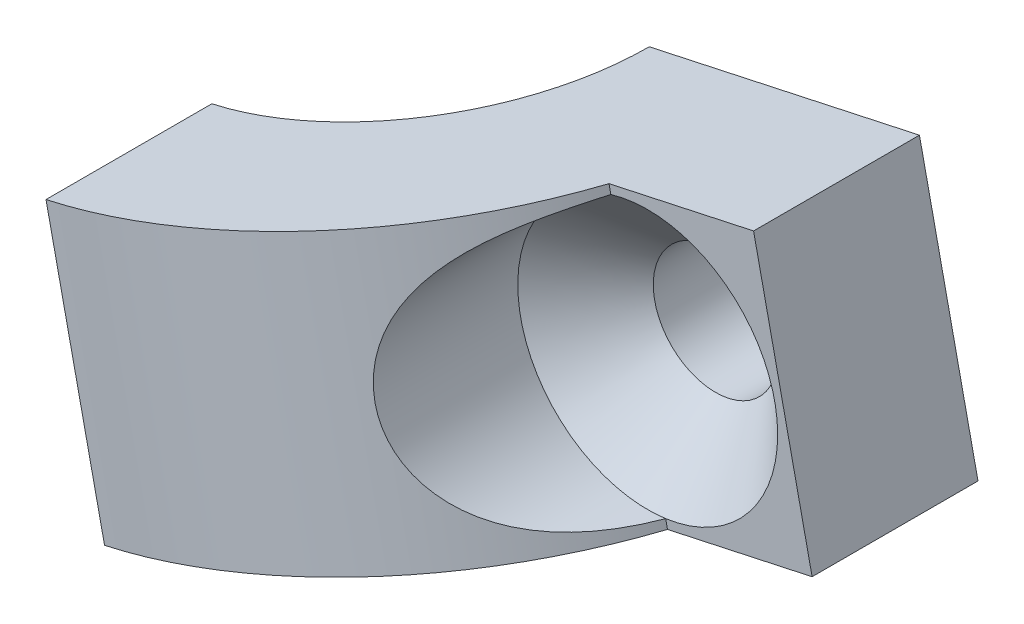
ISO-10303-21;
HEADER;
FILE_DESCRIPTION(('STEP AP214'),'2;1');
FILE_NAME('part.step','',(''),(''),'','','');
FILE_SCHEMA(('AUTOMOTIVE_DESIGN { 1 0 10303 214 1 1 1 1 }'));
ENDSEC;
DATA;
#1=APPLICATION_CONTEXT('core data for automotive mechanical design processes');
#2=APPLICATION_PROTOCOL_DEFINITION('international standard','automotive_design',2000,#1);
#3=PRODUCT_CONTEXT('',#1,'mechanical');
#4=PRODUCT('Part','Part','',(#3));
#5=PRODUCT_RELATED_PRODUCT_CATEGORY('part','',(#4));
#6=PRODUCT_DEFINITION_FORMATION('','',#4);
#7=PRODUCT_DEFINITION_CONTEXT('part definition',#1,'design');
#8=PRODUCT_DEFINITION('design','',#6,#7);
#9=PRODUCT_DEFINITION_SHAPE('','',#8);
#10=(LENGTH_UNIT() NAMED_UNIT(*) SI_UNIT(.MILLI.,.METRE.));
#11=(NAMED_UNIT(*) PLANE_ANGLE_UNIT() SI_UNIT($,.RADIAN.));
#12=(NAMED_UNIT(*) SI_UNIT($,.STERADIAN.) SOLID_ANGLE_UNIT());
#13=UNCERTAINTY_MEASURE_WITH_UNIT(LENGTH_MEASURE(1.E-05),#10,'distance_accuracy_value','');
#14=(GEOMETRIC_REPRESENTATION_CONTEXT(3) GLOBAL_UNCERTAINTY_ASSIGNED_CONTEXT((#13)) GLOBAL_UNIT_ASSIGNED_CONTEXT((#10,
#11,#12)) REPRESENTATION_CONTEXT('',''));
#15=CARTESIAN_POINT('',(0.,0.,0.));
#16=DIRECTION('',(0.,0.,1.));
#17=DIRECTION('',(1.,0.,0.));
#18=AXIS2_PLACEMENT_3D('',#15,#16,#17);
#19=CARTESIAN_POINT('',(-88.763948051682,-50.8660520084268,10.0615310259319));
#20=DIRECTION('',(0.21174441426743,-0.977325075410707,0.));
#21=DIRECTION('',(0.977325075410707,0.21174441426743,0.));
#22=AXIS2_PLACEMENT_3D('',#19,#20,#21);
#23=CYLINDRICAL_SURFACE('',#22,14.);
#24=CARTESIAN_POINT('',(-74.3505115745629,-57.6549076022219,16.0615310259319));
#25=CARTESIAN_POINT('',(-74.4105318311961,-57.6632767572205,16.1889325853136));
#26=CARTESIAN_POINT('',(-74.4726900893355,-57.6707717632351,16.3153746019921));
#27=CARTESIAN_POINT('',(-74.6013086436039,-57.6835064911919,16.566208653269));
#28=CARTESIAN_POINT('',(-74.6677701136839,-57.6887455946981,16.6906001167495));
#29=CARTESIAN_POINT('',(-74.8741545338677,-57.700343096729,17.0613993256941));
#30=CARTESIAN_POINT('',(-75.020590186598,-57.7025053316506,17.3043941340061));
#31=CARTESIAN_POINT('',(-75.3322600846562,-57.6908700686888,17.7823935250871));
#32=CARTESIAN_POINT('',(-75.4977221488477,-57.6768559368391,18.0172452416825));
#33=CARTESIAN_POINT('',(-75.8440735541703,-57.6268844159477,18.4723852549877));
#34=CARTESIAN_POINT('',(-76.0249302380549,-57.5909725283343,18.6927027032967));
#35=CARTESIAN_POINT('',(-76.3097669959853,-57.5149460669118,19.0146603048789));
#36=CARTESIAN_POINT('',(-76.4092439699416,-57.4850164570772,19.1227588173579));
#37=CARTESIAN_POINT('',(-76.6109515356726,-57.4165799788593,19.3335923509711));
#38=CARTESIAN_POINT('',(-76.7131822088843,-57.3780728565623,19.436327213218));
#39=CARTESIAN_POINT('',(-76.9191261447044,-57.2917792890537,19.6354085489783));
#40=CARTESIAN_POINT('',(-77.0228322603495,-57.2440288175781,19.7317779063903));
#41=CARTESIAN_POINT('',(-77.2310338652996,-57.1383707783662,19.917903786673));
#42=CARTESIAN_POINT('',(-77.3355293427551,-57.0804633628119,20.0076604085941));
#43=CARTESIAN_POINT('',(-77.5453740867343,-56.9530155936544,20.1810152179169));
#44=CARTESIAN_POINT('',(-77.6507166920066,-56.8833332522485,20.2645177185925));
#45=CARTESIAN_POINT('',(-77.8592827174098,-56.7324337160199,20.4233431233227));
#46=CARTESIAN_POINT('',(-77.9625065555144,-56.6512188217727,20.4986676534873));
#47=CARTESIAN_POINT('',(-78.1651007332548,-56.4770649067463,20.64051728855));
#48=CARTESIAN_POINT('',(-78.2644706227155,-56.3841245216872,20.7070413676531));
#49=CARTESIAN_POINT('',(-78.4574392958355,-56.1867146221291,20.8306962928452));
#50=CARTESIAN_POINT('',(-78.551039373874,-56.0822477082304,20.8878292505336));
#51=CARTESIAN_POINT('',(-78.7174399489771,-55.8784263140686,20.9846090018167));
#52=CARTESIAN_POINT('',(-78.7912819048968,-55.7805526266571,21.0255909416124));
#53=CARTESIAN_POINT('',(-78.9322090794733,-55.5774028618955,21.1001369687582));
#54=CARTESIAN_POINT('',(-78.9992954927088,-55.4721280988839,21.1337023688287));
#55=CARTESIAN_POINT('',(-79.1256123651839,-55.2550139874895,21.1932274542522));
#56=CARTESIAN_POINT('',(-79.184847746796,-55.1431788163619,21.2191919176383));
#57=CARTESIAN_POINT('',(-79.2945734116947,-54.9138418661736,21.2634208043114));
#58=CARTESIAN_POINT('',(-79.3450647738362,-54.7963407884743,21.2816861779271));
#59=CARTESIAN_POINT('',(-79.4301837055664,-54.5734260462372,21.3084455172993));
#60=CARTESIAN_POINT('',(-79.4660404995759,-54.4685991189413,21.3179440380137));
#61=CARTESIAN_POINT('',(-79.5303313630754,-54.2563400197448,21.3311509714235));
#62=CARTESIAN_POINT('',(-79.5587660666431,-54.1489080712517,21.334859878867));
#63=CARTESIAN_POINT('',(-79.6079440541267,-53.9322996460521,21.3364774977943));
#64=CARTESIAN_POINT('',(-79.6286902644741,-53.8231238496363,21.3343884187113));
#65=CARTESIAN_POINT('',(-79.662369388805,-53.6038346358174,21.3244206225268));
#66=CARTESIAN_POINT('',(-79.6753023008791,-53.4937212181851,21.3165419040106));
#67=CARTESIAN_POINT('',(-79.6929791042372,-53.2778506153099,21.2954505703755));
#68=CARTESIAN_POINT('',(-79.6980312203503,-53.1720962108652,21.2824650487072));
#69=CARTESIAN_POINT('',(-79.7010231309726,-52.9612353378817,21.2512127947903));
#70=CARTESIAN_POINT('',(-79.6989606026073,-52.8561290921841,21.2329443394901));
#71=CARTESIAN_POINT('',(-79.6879181095969,-52.6473751432259,21.1911919404382));
#72=CARTESIAN_POINT('',(-79.678941083093,-52.5437268394934,21.1677102149498));
#73=CARTESIAN_POINT('',(-79.6543634882828,-52.338495999793,21.1155958879873));
#74=CARTESIAN_POINT('',(-79.6387604414274,-52.2369142517624,21.086961361353));
#75=CARTESIAN_POINT('',(-79.6008593331339,-52.0340883090887,21.0239003100824));
#76=CARTESIAN_POINT('',(-79.5784100892131,-51.9329102800488,20.9893516503842));
#77=CARTESIAN_POINT('',(-79.5274539721781,-51.7340145586411,20.9151043767202));
#78=CARTESIAN_POINT('',(-79.4989449150615,-51.6362981287127,20.8754039080182));
#79=CARTESIAN_POINT('',(-79.4051412834227,-51.3491898177122,20.7488192815317));
#80=CARTESIAN_POINT('',(-79.331544955748,-51.1657091317666,20.6544116195021));
#81=CARTESIAN_POINT('',(-79.1598257095648,-50.8023015106871,20.4380344812624));
#82=CARTESIAN_POINT('',(-79.0600922675955,-50.6241782103171,20.3143498368074));
#83=CARTESIAN_POINT('',(-78.84677934502,-50.2923799142761,20.0478744005485));
#84=CARTESIAN_POINT('',(-78.7332001980957,-50.1387043296202,19.9050840691839));
#85=CARTESIAN_POINT('',(-78.5259357099715,-49.8891254587009,19.6388931042252));
#86=CARTESIAN_POINT('',(-78.4338912533118,-49.7881513772491,19.5188834735346));
#87=CARTESIAN_POINT('',(-78.2473437508216,-49.5996554295464,19.2704106774982));
#88=CARTESIAN_POINT('',(-78.1528395902768,-49.5121397911685,19.1419436375335));
#89=CARTESIAN_POINT('',(-77.9628513814775,-49.349350254235,18.8770505201755));
#90=CARTESIAN_POINT('',(-77.8673648074618,-49.274137074378,18.7405892291127));
#91=CARTESIAN_POINT('',(-77.6773833963092,-49.1353578461636,18.4611918883765));
#92=CARTESIAN_POINT('',(-77.5828888098764,-49.0717946783308,18.3182542482596));
#93=CARTESIAN_POINT('',(-77.3837390426929,-48.9474269452014,18.0073805012688));
#94=CARTESIAN_POINT('',(-77.2794026870516,-48.8881118950006,17.8386468655717));
#95=CARTESIAN_POINT('',(-77.0749911289246,-48.7812666096272,17.4949256562108));
#96=CARTESIAN_POINT('',(-76.9749176655176,-48.7337411466809,17.3199355827311));
#97=CARTESIAN_POINT('',(-76.7813685715217,-48.6493966071976,16.9668262209334));
#98=CARTESIAN_POINT('',(-76.6878262056926,-48.6124513617191,16.7887732048334));
#99=CARTESIAN_POINT('',(-76.506852766219,-48.5470720423813,16.4283049218811));
#100=CARTESIAN_POINT('',(-76.4194149684694,-48.5186284869277,16.2458947615158));
#101=CARTESIAN_POINT('',(-76.3353543645785,-48.4936901215073,16.0615310259319));
#102=B_SPLINE_CURVE_WITH_KNOTS('',3,(#24,#25,#26,#27,#28,#29,#30,#31,#32,#33,#34,#35,#36,#37,
#38,#39,#40,#41,#42,#43,#44,#45,#46,#47,#48,#49,#50,#51,#52,#53,#54,#55,#56,#57,#58,#59,#60,#61,
#62,#63,#64,#65,#66,#67,#68,#69,#70,#71,#72,#73,#74,#75,#76,#77,#78,#79,#80,#81,#82,#83,#84,#85,
#86,#87,#88,#89,#90,#91,#92,#93,#94,#95,#96,#97,#98,#99,#100,#101),.UNSPECIFIED.,.F.,.F.,(4,2,2,
2,2,2,2,2,2,2,2,2,2,2,2,2,2,2,2,2,2,2,2,2,2,2,2,2,2,2,2,2,2,2,2,2,2,2,4),(0.,0.423195212599901,
0.846506366717778,1.69656664790167,2.55814432224946,3.41793779315518,3.86740222850699,
4.31687997078536,4.76464236023339,5.21239804140925,5.66599869222498,6.11950898313149,
6.57307208944403,7.02653307189473,7.41378176107854,7.80096185260986,8.18789803323318,
8.57478643881463,8.90796041086747,9.24110591016724,9.57412447546437,9.90714312214091,
10.2267778523461,10.5465169506049,10.8661202587181,11.1858432240619,11.5132120962572,
11.8406991553248,12.495263156672,13.2086950237053,13.9221097004129,14.4669488469127,
15.0120393630653,15.5597438963677,16.1075836702451,16.728237428969,17.3491420094343,
17.9623006128011,18.5747728112579),.UNSPECIFIED.);
#103=CARTESIAN_POINT('',(-74.3505115745622,-57.6549076022247,16.0615310259319));
#104=VERTEX_POINT('',#103);
#105=CARTESIAN_POINT('',(-76.3353543645781,-48.4936901215092,16.0615310259319));
#106=VERTEX_POINT('',#105);
#107=EDGE_CURVE('E49',#104,#106,#102,.T.);
#108=ORIENTED_EDGE('',*,*,#107,.T.);
#109=DIRECTION('',(0.21174441426743,-0.977325075410707,0.));
#110=VECTOR('',#109,1.);
#111=CARTESIAN_POINT('',(-76.4016550409073,-48.1876734848134,16.0615310259319));
#112=LINE('',#111,#110);
#113=CARTESIAN_POINT('',(-76.4016550409073,-48.1876734848134,16.0615310259319));
#114=VERTEX_POINT('',#113);
#115=EDGE_CURVE('E145',#114,#106,#112,.T.);
#116=ORIENTED_EDGE('',*,*,#115,.F.);
#117=CARTESIAN_POINT('',(-88.763948051682,-50.8660520084268,10.0615310259319));
#118=DIRECTION('',(-0.21174441426743,0.977325075410707,0.));
#119=DIRECTION('',(-0.977325075410707,-0.21174441426743,0.));
#120=AXIS2_PLACEMENT_3D('',#117,#118,#119);
#121=CIRCLE('',#120,14.);
#122=CARTESIAN_POINT('',(-88.763948051682,-50.8660520084268,24.0615310259319));
#123=VERTEX_POINT('',#122);
#124=EDGE_CURVE('E108',#123,#114,#121,.T.);
#125=ORIENTED_EDGE('',*,*,#124,.F.);
#126=DIRECTION('',(0.21174441426743,-0.977325075410707,0.));
#127=VECTOR('',#126,1.);
#128=CARTESIAN_POINT('',(-88.763948051682,-50.8660520084268,24.0615310259319));
#129=LINE('',#128,#127);
#130=CARTESIAN_POINT('',(-86.6465039090076,-60.6393027625338,24.0615310259319));
#131=VERTEX_POINT('',#130);
#132=EDGE_CURVE('E43',#123,#131,#129,.T.);
#133=ORIENTED_EDGE('',*,*,#132,.T.);
#134=CARTESIAN_POINT('',(-86.6465039090076,-60.6393027625338,10.0615310259319));
#135=DIRECTION('',(-0.21174441426743,0.977325075410707,0.));
#136=DIRECTION('',(-0.977325075410707,-0.21174441426743,0.));
#137=AXIS2_PLACEMENT_3D('',#134,#135,#136);
#138=CIRCLE('',#137,14.);
#139=CARTESIAN_POINT('',(-74.284210898233,-57.9609242389205,16.0615310259319));
#140=VERTEX_POINT('',#139);
#141=EDGE_CURVE('E135',#131,#140,#138,.T.);
#142=ORIENTED_EDGE('',*,*,#141,.T.);
#143=EDGE_CURVE('E120',#104,#140,#112,.T.);
#144=ORIENTED_EDGE('',*,*,#143,.F.);
#145=EDGE_LOOP('',(#108,#116,#125,#133,#142,#144));
#146=FACE_BOUND('',#145,.T.);
#147=ADVANCED_FACE('F35',(#146),#23,.T.);
#148=CARTESIAN_POINT('',(-88.763948051682,-50.8660520084268,10.0615310259319));
#149=DIRECTION('',(0.21174441426743,-0.977325075410707,0.));
#150=DIRECTION('',(0.977325075410707,0.21174441426743,0.));
#151=AXIS2_PLACEMENT_3D('',#148,#149,#150);
#152=CYLINDRICAL_SURFACE('',#151,8.00000000000001);
#153=CARTESIAN_POINT('',(-86.6465039090076,-60.6393027625338,10.0615310259319));
#154=DIRECTION('',(0.21174441426743,-0.977325075410707,0.));
#155=DIRECTION('',(-0.977325075410707,-0.21174441426743,0.));
#156=AXIS2_PLACEMENT_3D('',#153,#154,#155);
#157=CIRCLE('',#156,8.00000000000001);
#158=CARTESIAN_POINT('',(-78.827903305722,-58.9453474483944,10.0615310259319));
#159=VERTEX_POINT('',#158);
#160=CARTESIAN_POINT('',(-86.6465039090076,-60.6393027625338,18.0615310259319));
#161=VERTEX_POINT('',#160);
#162=EDGE_CURVE('E129',#159,#161,#157,.T.);
#163=ORIENTED_EDGE('',*,*,#162,.T.);
#164=DIRECTION('',(0.21174441426743,-0.977325075410707,0.));
#165=VECTOR('',#164,1.);
#166=CARTESIAN_POINT('',(-88.763948051682,-50.8660520084268,18.0615310259319));
#167=LINE('',#166,#165);
#168=CARTESIAN_POINT('',(-88.763948051682,-50.8660520084268,18.0615310259319));
#169=VERTEX_POINT('',#168);
#170=EDGE_CURVE('E11',#169,#161,#167,.T.);
#171=ORIENTED_EDGE('',*,*,#170,.F.);
#172=CARTESIAN_POINT('',(-88.763948051682,-50.8660520084268,10.0615310259319));
#173=DIRECTION('',(0.21174441426743,-0.977325075410707,0.));
#174=DIRECTION('',(-0.977325075410707,-0.21174441426743,0.));
#175=AXIS2_PLACEMENT_3D('',#172,#173,#174);
#176=CIRCLE('',#175,8.00000000000001);
#177=CARTESIAN_POINT('',(-80.9453474483963,-49.1720966942873,10.0615310259319));
#178=VERTEX_POINT('',#177);
#179=EDGE_CURVE('E142',#178,#169,#176,.T.);
#180=ORIENTED_EDGE('',*,*,#179,.F.);
#181=DIRECTION('',(0.21174441426743,-0.977325075410707,0.));
#182=VECTOR('',#181,1.);
#183=CARTESIAN_POINT('',(-80.9453474483963,-49.1720966942873,10.0615310259319));
#184=LINE('',#183,#182);
#185=EDGE_CURVE('E125',#178,#159,#184,.T.);
#186=ORIENTED_EDGE('',*,*,#185,.T.);
#187=EDGE_LOOP('',(#163,#171,#180,#186));
#188=FACE_BOUND('',#187,.T.);
#189=ADVANCED_FACE('F37',(#188),#152,.F.);
#190=CARTESIAN_POINT('',(-88.763948051682,-50.8660520084268,18.0615310259319));
#191=DIRECTION('',(0.977325075410707,0.21174441426743,0.));
#192=DIRECTION('',(-0.21174441426743,0.977325075410707,0.));
#193=AXIS2_PLACEMENT_3D('',#190,#191,#192);
#194=PLANE('',#193);
#195=DIRECTION('',(0.,0.,1.));
#196=VECTOR('',#195,1.);
#197=CARTESIAN_POINT('',(-86.6465039090076,-60.6393027625338,18.0615310259319));
#198=LINE('',#197,#196);
#199=EDGE_CURVE('E132',#161,#131,#198,.T.);
#200=ORIENTED_EDGE('',*,*,#199,.T.);
#201=ORIENTED_EDGE('',*,*,#132,.F.);
#202=DIRECTION('',(0.,0.,1.));
#203=VECTOR('',#202,1.);
#204=CARTESIAN_POINT('',(-88.763948051682,-50.8660520084268,18.0615310259319));
#205=LINE('',#204,#203);
#206=EDGE_CURVE('E93',#169,#123,#205,.T.);
#207=ORIENTED_EDGE('',*,*,#206,.F.);
#208=ORIENTED_EDGE('',*,*,#170,.T.);
#209=EDGE_LOOP('',(#200,#201,#207,#208));
#210=FACE_BOUND('',#209,.T.);
#211=ADVANCED_FACE('F198',(#210),#194,.F.);
#212=CARTESIAN_POINT('',(-71.1720966942892,-47.054652551613,16.0615310259319));
#213=DIRECTION('',(0.,0.,-1.));
#214=DIRECTION('',(-1.,0.,0.));
#215=AXIS2_PLACEMENT_3D('',#212,#213,#214);
#216=PLANE('',#215);
#217=ORIENTED_EDGE('',*,*,#115,.T.);
#218=CARTESIAN_POINT('',(-75.0000000000054,-53.0000000000037,16.0615310259319));
#219=DIRECTION('',(0.,0.,1.));
#220=DIRECTION('',(1.,0.,0.));
#221=AXIS2_PLACEMENT_3D('',#218,#219,#220);
#222=CIRCLE('',#221,4.7);
#223=EDGE_CURVE('E161',#104,#106,#222,.T.);
#224=ORIENTED_EDGE('',*,*,#223,.F.);
#225=ORIENTED_EDGE('',*,*,#143,.T.);
#226=DIRECTION('',(0.977325075410706,0.21174441426743,0.));
#227=VECTOR('',#226,1.);
#228=CARTESIAN_POINT('',(-69.0546525516149,-56.8279033057201,16.0615310259319));
#229=LINE('',#228,#227);
#230=CARTESIAN_POINT('',(-69.0546525516149,-56.8279033057201,16.0615310259319));
#231=VERTEX_POINT('',#230);
#232=EDGE_CURVE('E117',#140,#231,#229,.T.);
#233=ORIENTED_EDGE('',*,*,#232,.T.);
#234=DIRECTION('',(0.21174441426743,-0.977325075410707,0.));
#235=VECTOR('',#234,1.);
#236=CARTESIAN_POINT('',(-71.1720966942892,-47.054652551613,16.0615310259319));
#237=LINE('',#236,#235);
#238=CARTESIAN_POINT('',(-71.1720966942892,-47.054652551613,16.0615310259319));
#239=VERTEX_POINT('',#238);
#240=EDGE_CURVE('E114',#239,#231,#237,.T.);
#241=ORIENTED_EDGE('',*,*,#240,.F.);
#242=DIRECTION('',(0.977325075410706,0.21174441426743,0.));
#243=VECTOR('',#242,1.);
#244=CARTESIAN_POINT('',(-71.1720966942892,-47.054652551613,16.0615310259319));
#245=LINE('',#244,#243);
#246=EDGE_CURVE('E101',#114,#239,#245,.T.);
#247=ORIENTED_EDGE('',*,*,#246,.F.);
#248=EDGE_LOOP('',(#217,#224,#225,#233,#241,#247));
#249=FACE_BOUND('',#248,.T.);
#250=ADVANCED_FACE('F115',(#249),#216,.F.);
#251=CARTESIAN_POINT('',(-71.1720966942892,-47.054652551613,10.0615310259319));
#252=DIRECTION('',(-0.977325075410707,-0.21174441426743,0.));
#253=DIRECTION('',(0.21174441426743,-0.977325075410707,0.));
#254=AXIS2_PLACEMENT_3D('',#251,#252,#253);
#255=PLANE('',#254);
#256=DIRECTION('',(0.,0.,-1.));
#257=VECTOR('',#256,1.);
#258=CARTESIAN_POINT('',(-69.0546525516149,-56.8279033057201,10.0615310259319));
#259=LINE('',#258,#257);
#260=CARTESIAN_POINT('',(-69.0546525516149,-56.8279033057201,10.0615310259319));
#261=VERTEX_POINT('',#260);
#262=EDGE_CURVE('E139',#231,#261,#259,.T.);
#263=ORIENTED_EDGE('',*,*,#262,.T.);
#264=DIRECTION('',(0.21174441426743,-0.977325075410707,0.));
#265=VECTOR('',#264,1.);
#266=CARTESIAN_POINT('',(-71.1720966942892,-47.054652551613,10.0615310259319));
#267=LINE('',#266,#265);
#268=CARTESIAN_POINT('',(-71.1720966942892,-47.054652551613,10.0615310259319));
#269=VERTEX_POINT('',#268);
#270=EDGE_CURVE('E121',#269,#261,#267,.T.);
#271=ORIENTED_EDGE('',*,*,#270,.F.);
#272=DIRECTION('',(0.,0.,-1.));
#273=VECTOR('',#272,1.);
#274=CARTESIAN_POINT('',(-71.1720966942892,-47.054652551613,10.0615310259319));
#275=LINE('',#274,#273);
#276=EDGE_CURVE('E105',#239,#269,#275,.T.);
#277=ORIENTED_EDGE('',*,*,#276,.F.);
#278=ORIENTED_EDGE('',*,*,#240,.T.);
#279=EDGE_LOOP('',(#263,#271,#277,#278));
#280=FACE_BOUND('',#279,.T.);
#281=ADVANCED_FACE('F123',(#280),#255,.F.);
#282=CARTESIAN_POINT('',(-80.9453474483963,-49.1720966942873,10.0615310259319));
#283=DIRECTION('',(0.,0.,1.));
#284=DIRECTION('',(1.,0.,0.));
#285=AXIS2_PLACEMENT_3D('',#282,#283,#284);
#286=PLANE('',#285);
#287=CARTESIAN_POINT('',(-75.0000000000054,-53.0000000000037,10.0615310259319));
#288=DIRECTION('',(0.,0.,1.));
#289=DIRECTION('',(1.,0.,0.));
#290=AXIS2_PLACEMENT_3D('',#287,#288,#289);
#291=CIRCLE('',#290,2.25);
#292=CARTESIAN_POINT('',(-72.7500000000054,-53.0000000000037,10.0615310259319));
#293=VERTEX_POINT('',#292);
#294=EDGE_CURVE('E165',#293,#293,#291,.T.);
#295=ORIENTED_EDGE('',*,*,#294,.T.);
#296=EDGE_LOOP('',(#295));
#297=FACE_BOUND('',#296,.T.);
#298=DIRECTION('',(-0.977325075410706,-0.21174441426743,0.));
#299=VECTOR('',#298,1.);
#300=CARTESIAN_POINT('',(-78.827903305722,-58.9453474483944,10.0615310259319));
#301=LINE('',#300,#299);
#302=EDGE_CURVE('E85',#261,#159,#301,.T.);
#303=ORIENTED_EDGE('',*,*,#302,.T.);
#304=ORIENTED_EDGE('',*,*,#185,.F.);
#305=DIRECTION('',(-0.977325075410706,-0.21174441426743,0.));
#306=VECTOR('',#305,1.);
#307=CARTESIAN_POINT('',(-80.9453474483963,-49.1720966942873,10.0615310259319));
#308=LINE('',#307,#306);
#309=EDGE_CURVE('E58',#269,#178,#308,.T.);
#310=ORIENTED_EDGE('',*,*,#309,.F.);
#311=ORIENTED_EDGE('',*,*,#270,.T.);
#312=EDGE_LOOP('',(#303,#304,#310,#311));
#313=FACE_BOUND('',#312,.T.);
#314=ADVANCED_FACE('F153',(#297,#313),#286,.F.);
#315=CARTESIAN_POINT('',(-88.763948051682,-50.8660520084268,10.0615310259319));
#316=DIRECTION('',(-0.21174441426743,0.977325075410707,0.));
#317=DIRECTION('',(-0.977325075410707,-0.21174441426743,0.));
#318=AXIS2_PLACEMENT_3D('',#315,#316,#317);
#319=PLANE('',#318);
#320=ORIENTED_EDGE('',*,*,#179,.T.);
#321=ORIENTED_EDGE('',*,*,#206,.T.);
#322=ORIENTED_EDGE('',*,*,#124,.T.);
#323=ORIENTED_EDGE('',*,*,#246,.T.);
#324=ORIENTED_EDGE('',*,*,#276,.T.);
#325=ORIENTED_EDGE('',*,*,#309,.T.);
#326=EDGE_LOOP('',(#320,#321,#322,#323,#324,#325));
#327=FACE_BOUND('',#326,.T.);
#328=ADVANCED_FACE('F103',(#327),#319,.T.);
#329=CARTESIAN_POINT('',(-86.6465039090076,-60.6393027625338,10.0615310259319));
#330=DIRECTION('',(-0.21174441426743,0.977325075410707,0.));
#331=DIRECTION('',(-0.977325075410707,-0.21174441426743,0.));
#332=AXIS2_PLACEMENT_3D('',#329,#330,#331);
#333=PLANE('',#332);
#334=ORIENTED_EDGE('',*,*,#162,.F.);
#335=ORIENTED_EDGE('',*,*,#302,.F.);
#336=ORIENTED_EDGE('',*,*,#262,.F.);
#337=ORIENTED_EDGE('',*,*,#232,.F.);
#338=ORIENTED_EDGE('',*,*,#141,.F.);
#339=ORIENTED_EDGE('',*,*,#199,.F.);
#340=EDGE_LOOP('',(#334,#335,#336,#337,#338,#339));
#341=FACE_BOUND('',#340,.T.);
#342=ADVANCED_FACE('F152',(#341),#333,.F.);
#343=CARTESIAN_POINT('',(-75.0000000000054,-53.0000000000037,16.0615310259319));
#344=DIRECTION('',(0.,0.,1.));
#345=DIRECTION('',(1.,0.,0.));
#346=AXIS2_PLACEMENT_3D('',#343,#344,#345);
#347=CONICAL_SURFACE('',#346,4.7,0.785398163397447);
#348=CARTESIAN_POINT('',(-75.0000000000054,-53.0000000000037,13.6115310259319));
#349=DIRECTION('',(0.,0.,1.));
#350=DIRECTION('',(1.,0.,0.));
#351=AXIS2_PLACEMENT_3D('',#348,#349,#350);
#352=CIRCLE('',#351,2.25);
#353=CARTESIAN_POINT('',(-72.7500000000054,-53.0000000000037,13.6115310259319));
#354=VERTEX_POINT('',#353);
#355=EDGE_CURVE('E162',#354,#354,#352,.T.);
#356=ORIENTED_EDGE('',*,*,#355,.F.);
#357=EDGE_LOOP('',(#356));
#358=FACE_BOUND('',#357,.T.);
#359=EDGE_CURVE('E133',#106,#104,#222,.T.);
#360=ORIENTED_EDGE('',*,*,#359,.T.);
#361=ORIENTED_EDGE('',*,*,#223,.T.);
#362=EDGE_LOOP('',(#360,#361));
#363=FACE_BOUND('',#362,.T.);
#364=ADVANCED_FACE('F182',(#358,#363),#347,.F.);
#365=CARTESIAN_POINT('',(-75.0000000000054,-53.0000000000037,16.0615310259319));
#366=DIRECTION('',(0.,0.,1.));
#367=DIRECTION('',(1.,0.,0.));
#368=AXIS2_PLACEMENT_3D('',#365,#366,#367);
#369=CYLINDRICAL_SURFACE('',#368,2.25);
#370=ORIENTED_EDGE('',*,*,#294,.F.);
#371=EDGE_LOOP('',(#370));
#372=FACE_BOUND('',#371,.T.);
#373=ORIENTED_EDGE('',*,*,#355,.T.);
#374=EDGE_LOOP('',(#373));
#375=FACE_BOUND('',#374,.T.);
#376=ADVANCED_FACE('F179',(#372,#375),#369,.F.);
#377=CARTESIAN_POINT('',(-75.,-53.,24.0625310259319));
#378=DIRECTION('',(0.,0.,-1.));
#379=DIRECTION('',(-1.,0.,0.));
#380=AXIS2_PLACEMENT_3D('',#377,#378,#379);
#381=CYLINDRICAL_SURFACE('',#380,4.69999999999999);
#382=ORIENTED_EDGE('',*,*,#359,.F.);
#383=ORIENTED_EDGE('',*,*,#107,.F.);
#384=EDGE_LOOP('',(#382,#383));
#385=FACE_BOUND('',#384,.T.);
#386=ADVANCED_FACE('F174',(#385),#381,.F.);
#387=CLOSED_SHELL('',(#147,#189,#211,#250,#281,#314,#328,#342,#364,#376,#386));
#388=MANIFOLD_SOLID_BREP('B2',#387);
#389=ADVANCED_BREP_SHAPE_REPRESENTATION('',(#18,#388),#14);
#390=SHAPE_DEFINITION_REPRESENTATION(#9,#389);
ENDSEC;
END-ISO-10303-21;
